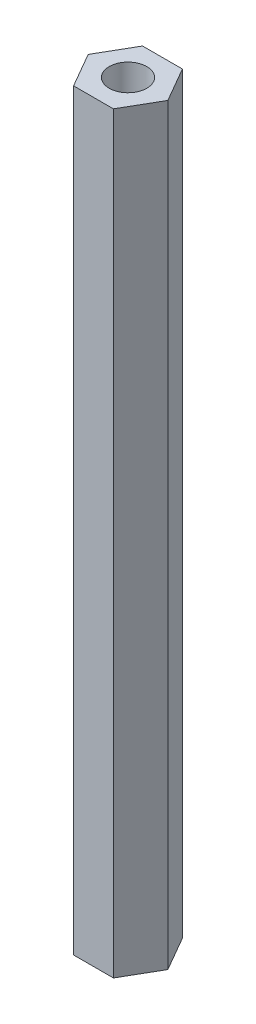
ISO-10303-21;
HEADER;
FILE_DESCRIPTION(('STEP AP214'),'2;1');
FILE_NAME('part.step','',(''),(''),'','','');
FILE_SCHEMA(('AUTOMOTIVE_DESIGN { 1 0 10303 214 1 1 1 1 }'));
ENDSEC;
DATA;
#1=APPLICATION_CONTEXT('core data for automotive mechanical design processes');
#2=APPLICATION_PROTOCOL_DEFINITION('international standard','automotive_design',2000,#1);
#3=PRODUCT_CONTEXT('',#1,'mechanical');
#4=PRODUCT('Part','Part','',(#3));
#5=PRODUCT_RELATED_PRODUCT_CATEGORY('part','',(#4));
#6=PRODUCT_DEFINITION_FORMATION('','',#4);
#7=PRODUCT_DEFINITION_CONTEXT('part definition',#1,'design');
#8=PRODUCT_DEFINITION('design','',#6,#7);
#9=PRODUCT_DEFINITION_SHAPE('','',#8);
#10=(LENGTH_UNIT() NAMED_UNIT(*) SI_UNIT(.MILLI.,.METRE.));
#11=(NAMED_UNIT(*) PLANE_ANGLE_UNIT() SI_UNIT($,.RADIAN.));
#12=(NAMED_UNIT(*) SI_UNIT($,.STERADIAN.) SOLID_ANGLE_UNIT());
#13=UNCERTAINTY_MEASURE_WITH_UNIT(LENGTH_MEASURE(1.E-05),#10,'distance_accuracy_value','');
#14=(GEOMETRIC_REPRESENTATION_CONTEXT(3) GLOBAL_UNCERTAINTY_ASSIGNED_CONTEXT((#13)) GLOBAL_UNIT_ASSIGNED_CONTEXT((#10,
#11,#12)) REPRESENTATION_CONTEXT('',''));
#15=CARTESIAN_POINT('',(0.,0.,0.));
#16=DIRECTION('',(0.,0.,1.));
#17=DIRECTION('',(1.,0.,0.));
#18=AXIS2_PLACEMENT_3D('',#15,#16,#17);
#19=CARTESIAN_POINT('',(1.5877132402715,60.,2.74999999999997));
#20=DIRECTION('',(-0.866025403784441,0.,-0.499999999999995));
#21=DIRECTION('',(-0.499999999999995,0.,0.866025403784442));
#22=AXIS2_PLACEMENT_3D('',#19,#20,#21);
#23=PLANE('',#22);
#24=DIRECTION('',(0.499999999999995,0.,-0.866025403784441));
#25=VECTOR('',#24,1.);
#26=CARTESIAN_POINT('',(1.5877132402715,0.,2.74999999999997));
#27=LINE('',#26,#25);
#28=CARTESIAN_POINT('',(1.5877132402715,0.,2.74999999999997));
#29=VERTEX_POINT('',#28);
#30=CARTESIAN_POINT('',(3.17542648054293,0.,0.));
#31=VERTEX_POINT('',#30);
#32=EDGE_CURVE('E117',#29,#31,#27,.T.);
#33=ORIENTED_EDGE('',*,*,#32,.T.);
#34=DIRECTION('',(0.,-1.,0.));
#35=VECTOR('',#34,1.);
#36=CARTESIAN_POINT('',(3.17542648054293,60.,0.));
#37=LINE('',#36,#35);
#38=CARTESIAN_POINT('',(3.17542648054293,60.,0.));
#39=VERTEX_POINT('',#38);
#40=EDGE_CURVE('E11',#39,#31,#37,.T.);
#41=ORIENTED_EDGE('',*,*,#40,.F.);
#42=DIRECTION('',(0.499999999999995,0.,-0.866025403784441));
#43=VECTOR('',#42,1.);
#44=CARTESIAN_POINT('',(1.5877132402715,60.,2.74999999999997));
#45=LINE('',#44,#43);
#46=CARTESIAN_POINT('',(1.5877132402715,60.,2.74999999999997));
#47=VERTEX_POINT('',#46);
#48=EDGE_CURVE('E128',#47,#39,#45,.T.);
#49=ORIENTED_EDGE('',*,*,#48,.F.);
#50=DIRECTION('',(0.,-1.,0.));
#51=VECTOR('',#50,1.);
#52=CARTESIAN_POINT('',(1.5877132402715,60.,2.74999999999997));
#53=LINE('',#52,#51);
#54=EDGE_CURVE('E113',#47,#29,#53,.T.);
#55=ORIENTED_EDGE('',*,*,#54,.T.);
#56=EDGE_LOOP('',(#33,#41,#49,#55));
#57=FACE_BOUND('',#56,.T.);
#58=ADVANCED_FACE('F33',(#57),#23,.F.);
#59=CARTESIAN_POINT('',(3.17542648054293,60.,0.));
#60=DIRECTION('',(-0.866025403784438,0.,0.500000000000001));
#61=DIRECTION('',(0.500000000000001,0.,0.866025403784438));
#62=AXIS2_PLACEMENT_3D('',#59,#60,#61);
#63=PLANE('',#62);
#64=DIRECTION('',(-0.500000000000001,0.,-0.866025403784438));
#65=VECTOR('',#64,1.);
#66=CARTESIAN_POINT('',(3.17542648054293,0.,0.));
#67=LINE('',#66,#65);
#68=CARTESIAN_POINT('',(1.58771324027146,0.,-2.74999999999999));
#69=VERTEX_POINT('',#68);
#70=EDGE_CURVE('E120',#31,#69,#67,.T.);
#71=ORIENTED_EDGE('',*,*,#70,.T.);
#72=DIRECTION('',(0.,-1.,0.));
#73=VECTOR('',#72,1.);
#74=CARTESIAN_POINT('',(1.58771324027146,60.,-2.74999999999999));
#75=LINE('',#74,#73);
#76=CARTESIAN_POINT('',(1.58771324027146,60.,-2.74999999999999));
#77=VERTEX_POINT('',#76);
#78=EDGE_CURVE('E41',#77,#69,#75,.T.);
#79=ORIENTED_EDGE('',*,*,#78,.F.);
#80=DIRECTION('',(-0.500000000000001,0.,-0.866025403784438));
#81=VECTOR('',#80,1.);
#82=CARTESIAN_POINT('',(3.17542648054293,60.,0.));
#83=LINE('',#82,#81);
#84=EDGE_CURVE('E86',#39,#77,#83,.T.);
#85=ORIENTED_EDGE('',*,*,#84,.F.);
#86=ORIENTED_EDGE('',*,*,#40,.T.);
#87=EDGE_LOOP('',(#71,#79,#85,#86));
#88=FACE_BOUND('',#87,.T.);
#89=ADVANCED_FACE('F153',(#88),#63,.F.);
#90=CARTESIAN_POINT('',(1.58771324027146,60.,-2.74999999999999));
#91=DIRECTION('',(0.,0.,1.));
#92=DIRECTION('',(1.,0.,0.));
#93=AXIS2_PLACEMENT_3D('',#90,#91,#92);
#94=PLANE('',#93);
#95=DIRECTION('',(-1.,0.,0.));
#96=VECTOR('',#95,1.);
#97=CARTESIAN_POINT('',(1.58771324027146,0.,-2.74999999999999));
#98=LINE('',#97,#96);
#99=CARTESIAN_POINT('',(-1.58771324027148,0.,-2.74999999999998));
#100=VERTEX_POINT('',#99);
#101=EDGE_CURVE('E123',#69,#100,#98,.T.);
#102=ORIENTED_EDGE('',*,*,#101,.T.);
#103=DIRECTION('',(0.,-1.,0.));
#104=VECTOR('',#103,1.);
#105=CARTESIAN_POINT('',(-1.58771324027148,60.,-2.74999999999998));
#106=LINE('',#105,#104);
#107=CARTESIAN_POINT('',(-1.58771324027148,60.,-2.74999999999998));
#108=VERTEX_POINT('',#107);
#109=EDGE_CURVE('E108',#108,#100,#106,.T.);
#110=ORIENTED_EDGE('',*,*,#109,.F.);
#111=DIRECTION('',(-1.,0.,0.));
#112=VECTOR('',#111,1.);
#113=CARTESIAN_POINT('',(1.58771324027146,60.,-2.74999999999999));
#114=LINE('',#113,#112);
#115=EDGE_CURVE('E99',#77,#108,#114,.T.);
#116=ORIENTED_EDGE('',*,*,#115,.F.);
#117=ORIENTED_EDGE('',*,*,#78,.T.);
#118=EDGE_LOOP('',(#102,#110,#116,#117));
#119=FACE_BOUND('',#118,.T.);
#120=ADVANCED_FACE('F134',(#119),#94,.F.);
#121=CARTESIAN_POINT('',(-1.58771324027148,60.,-2.74999999999998));
#122=DIRECTION('',(0.866025403784442,0.,0.499999999999995));
#123=DIRECTION('',(0.499999999999995,0.,-0.866025403784442));
#124=AXIS2_PLACEMENT_3D('',#121,#122,#123);
#125=PLANE('',#124);
#126=DIRECTION('',(-0.499999999999995,0.,0.866025403784442));
#127=VECTOR('',#126,1.);
#128=CARTESIAN_POINT('',(-1.58771324027148,0.,-2.74999999999998));
#129=LINE('',#128,#127);
#130=CARTESIAN_POINT('',(-3.17542648054293,0.,0.));
#131=VERTEX_POINT('',#130);
#132=EDGE_CURVE('E107',#100,#131,#129,.T.);
#133=ORIENTED_EDGE('',*,*,#132,.T.);
#134=DIRECTION('',(0.,-1.,0.));
#135=VECTOR('',#134,1.);
#136=CARTESIAN_POINT('',(-3.17542648054293,60.,0.));
#137=LINE('',#136,#135);
#138=CARTESIAN_POINT('',(-3.17542648054293,60.,0.));
#139=VERTEX_POINT('',#138);
#140=EDGE_CURVE('E104',#139,#131,#137,.T.);
#141=ORIENTED_EDGE('',*,*,#140,.F.);
#142=DIRECTION('',(-0.499999999999995,0.,0.866025403784442));
#143=VECTOR('',#142,1.);
#144=CARTESIAN_POINT('',(-1.58771324027148,60.,-2.74999999999998));
#145=LINE('',#144,#143);
#146=EDGE_CURVE('E93',#108,#139,#145,.T.);
#147=ORIENTED_EDGE('',*,*,#146,.F.);
#148=ORIENTED_EDGE('',*,*,#109,.T.);
#149=EDGE_LOOP('',(#133,#141,#147,#148));
#150=FACE_BOUND('',#149,.T.);
#151=ADVANCED_FACE('F105',(#150),#125,.F.);
#152=CARTESIAN_POINT('',(-3.17542648054293,60.,0.));
#153=DIRECTION('',(0.866025403784435,0.,-0.500000000000007));
#154=DIRECTION('',(-0.500000000000007,0.,-0.866025403784435));
#155=AXIS2_PLACEMENT_3D('',#152,#153,#154);
#156=PLANE('',#155);
#157=DIRECTION('',(0.500000000000007,0.,0.866025403784435));
#158=VECTOR('',#157,1.);
#159=CARTESIAN_POINT('',(-3.17542648054293,0.,0.));
#160=LINE('',#159,#158);
#161=CARTESIAN_POINT('',(-1.58771324027144,0.,2.75));
#162=VERTEX_POINT('',#161);
#163=EDGE_CURVE('E72',#131,#162,#160,.T.);
#164=ORIENTED_EDGE('',*,*,#163,.T.);
#165=DIRECTION('',(0.,-1.,0.));
#166=VECTOR('',#165,1.);
#167=CARTESIAN_POINT('',(-1.58771324027144,60.,2.75));
#168=LINE('',#167,#166);
#169=CARTESIAN_POINT('',(-1.58771324027144,60.,2.75));
#170=VERTEX_POINT('',#169);
#171=EDGE_CURVE('E109',#170,#162,#168,.T.);
#172=ORIENTED_EDGE('',*,*,#171,.F.);
#173=DIRECTION('',(0.500000000000007,0.,0.866025403784435));
#174=VECTOR('',#173,1.);
#175=CARTESIAN_POINT('',(-3.17542648054293,60.,0.));
#176=LINE('',#175,#174);
#177=EDGE_CURVE('E97',#139,#170,#176,.T.);
#178=ORIENTED_EDGE('',*,*,#177,.F.);
#179=ORIENTED_EDGE('',*,*,#140,.T.);
#180=EDGE_LOOP('',(#164,#172,#178,#179));
#181=FACE_BOUND('',#180,.T.);
#182=ADVANCED_FACE('F111',(#181),#156,.F.);
#183=CARTESIAN_POINT('',(-1.58771324027144,60.,2.75));
#184=DIRECTION('',(0.,0.,-1.));
#185=DIRECTION('',(-1.,0.,0.));
#186=AXIS2_PLACEMENT_3D('',#183,#184,#185);
#187=PLANE('',#186);
#188=DIRECTION('',(1.,0.,0.));
#189=VECTOR('',#188,1.);
#190=CARTESIAN_POINT('',(-1.58771324027144,0.,2.75));
#191=LINE('',#190,#189);
#192=EDGE_CURVE('E78',#162,#29,#191,.T.);
#193=ORIENTED_EDGE('',*,*,#192,.T.);
#194=ORIENTED_EDGE('',*,*,#54,.F.);
#195=DIRECTION('',(1.,0.,0.));
#196=VECTOR('',#195,1.);
#197=CARTESIAN_POINT('',(-1.58771324027144,60.,2.75));
#198=LINE('',#197,#196);
#199=EDGE_CURVE('E49',#170,#47,#198,.T.);
#200=ORIENTED_EDGE('',*,*,#199,.F.);
#201=ORIENTED_EDGE('',*,*,#171,.T.);
#202=EDGE_LOOP('',(#193,#194,#200,#201));
#203=FACE_BOUND('',#202,.T.);
#204=ADVANCED_FACE('F141',(#203),#187,.F.);
#205=CARTESIAN_POINT('',(0.,60.,0.));
#206=DIRECTION('',(0.,1.,0.));
#207=DIRECTION('',(0.,0.,1.));
#208=AXIS2_PLACEMENT_3D('',#205,#206,#207);
#209=PLANE('',#208);
#210=CARTESIAN_POINT('',(0.,60.,0.));
#211=DIRECTION('',(0.,1.,0.));
#212=DIRECTION('',(0.,0.,1.));
#213=AXIS2_PLACEMENT_3D('',#210,#211,#212);
#214=CIRCLE('',#213,1.5);
#215=CARTESIAN_POINT('',(0.,60.,1.5));
#216=VERTEX_POINT('',#215);
#217=EDGE_CURVE('E236',#216,#216,#214,.T.);
#218=ORIENTED_EDGE('',*,*,#217,.F.);
#219=EDGE_LOOP('',(#218));
#220=FACE_BOUND('',#219,.T.);
#221=ORIENTED_EDGE('',*,*,#48,.T.);
#222=ORIENTED_EDGE('',*,*,#84,.T.);
#223=ORIENTED_EDGE('',*,*,#115,.T.);
#224=ORIENTED_EDGE('',*,*,#146,.T.);
#225=ORIENTED_EDGE('',*,*,#177,.T.);
#226=ORIENTED_EDGE('',*,*,#199,.T.);
#227=EDGE_LOOP('',(#221,#222,#223,#224,#225,#226));
#228=FACE_BOUND('',#227,.T.);
#229=ADVANCED_FACE('F95',(#220,#228),#209,.T.);
#230=CARTESIAN_POINT('',(0.,0.,0.));
#231=DIRECTION('',(0.,1.,0.));
#232=DIRECTION('',(0.,0.,1.));
#233=AXIS2_PLACEMENT_3D('',#230,#231,#232);
#234=PLANE('',#233);
#235=CARTESIAN_POINT('',(0.,0.,0.));
#236=DIRECTION('',(0.,1.,0.));
#237=DIRECTION('',(0.,0.,1.));
#238=AXIS2_PLACEMENT_3D('',#235,#236,#237);
#239=CIRCLE('',#238,1.5);
#240=CARTESIAN_POINT('',(0.,0.,1.5));
#241=VERTEX_POINT('',#240);
#242=EDGE_CURVE('E237',#241,#241,#239,.T.);
#243=ORIENTED_EDGE('',*,*,#242,.T.);
#244=EDGE_LOOP('',(#243));
#245=FACE_BOUND('',#244,.T.);
#246=ORIENTED_EDGE('',*,*,#32,.F.);
#247=ORIENTED_EDGE('',*,*,#192,.F.);
#248=ORIENTED_EDGE('',*,*,#163,.F.);
#249=ORIENTED_EDGE('',*,*,#132,.F.);
#250=ORIENTED_EDGE('',*,*,#101,.F.);
#251=ORIENTED_EDGE('',*,*,#70,.F.);
#252=EDGE_LOOP('',(#246,#247,#248,#249,#250,#251));
#253=FACE_BOUND('',#252,.T.);
#254=ADVANCED_FACE('F137',(#245,#253),#234,.F.);
#255=CARTESIAN_POINT('',(0.,50.,0.));
#256=DIRECTION('',(0.,1.,0.));
#257=DIRECTION('',(0.,0.,1.));
#258=AXIS2_PLACEMENT_3D('',#255,#256,#257);
#259=CYLINDRICAL_SURFACE('',#258,1.5);
#260=CARTESIAN_POINT('',(0.,50.,0.));
#261=DIRECTION('',(0.,1.,0.));
#262=DIRECTION('',(0.,0.,1.));
#263=AXIS2_PLACEMENT_3D('',#260,#261,#262);
#264=CIRCLE('',#263,1.5);
#265=CARTESIAN_POINT('',(0.,50.,1.5));
#266=VERTEX_POINT('',#265);
#267=EDGE_CURVE('E121',#266,#266,#264,.T.);
#268=ORIENTED_EDGE('',*,*,#267,.F.);
#269=EDGE_LOOP('',(#268));
#270=FACE_BOUND('',#269,.T.);
#271=ORIENTED_EDGE('',*,*,#217,.T.);
#272=EDGE_LOOP('',(#271));
#273=FACE_BOUND('',#272,.T.);
#274=ADVANCED_FACE('F188',(#270,#273),#259,.F.);
#275=CARTESIAN_POINT('',(0.,50.,0.));
#276=DIRECTION('',(0.,1.,0.));
#277=DIRECTION('',(0.,0.,1.));
#278=AXIS2_PLACEMENT_3D('',#275,#276,#277);
#279=PLANE('',#278);
#280=ORIENTED_EDGE('',*,*,#267,.T.);
#281=EDGE_LOOP('',(#280));
#282=FACE_BOUND('',#281,.T.);
#283=ADVANCED_FACE('F193',(#282),#279,.T.);
#284=CARTESIAN_POINT('',(0.,10.,0.));
#285=DIRECTION('',(0.,-1.,0.));
#286=DIRECTION('',(0.,0.,-1.));
#287=AXIS2_PLACEMENT_3D('',#284,#285,#286);
#288=CYLINDRICAL_SURFACE('',#287,1.5);
#289=CARTESIAN_POINT('',(0.,10.,0.));
#290=DIRECTION('',(0.,1.,0.));
#291=DIRECTION('',(0.,0.,1.));
#292=AXIS2_PLACEMENT_3D('',#289,#290,#291);
#293=CIRCLE('',#292,1.5);
#294=CARTESIAN_POINT('',(0.,10.,1.5));
#295=VERTEX_POINT('',#294);
#296=EDGE_CURVE('E235',#295,#295,#293,.T.);
#297=ORIENTED_EDGE('',*,*,#296,.T.);
#298=EDGE_LOOP('',(#297));
#299=FACE_BOUND('',#298,.T.);
#300=ORIENTED_EDGE('',*,*,#242,.F.);
#301=EDGE_LOOP('',(#300));
#302=FACE_BOUND('',#301,.T.);
#303=ADVANCED_FACE('F203',(#299,#302),#288,.F.);
#304=CARTESIAN_POINT('',(0.,10.,0.));
#305=DIRECTION('',(0.,-1.,0.));
#306=DIRECTION('',(0.,0.,1.));
#307=AXIS2_PLACEMENT_3D('',#304,#305,#306);
#308=PLANE('',#307);
#309=ORIENTED_EDGE('',*,*,#296,.F.);
#310=EDGE_LOOP('',(#309));
#311=FACE_BOUND('',#310,.T.);
#312=ADVANCED_FACE('F219',(#311),#308,.T.);
#313=CLOSED_SHELL('',(#58,#89,#120,#151,#182,#204,#229,#254,#274,#283,#303,#312));
#314=MANIFOLD_SOLID_BREP('B2',#313);
#315=ADVANCED_BREP_SHAPE_REPRESENTATION('',(#18,#314),#14);
#316=SHAPE_DEFINITION_REPRESENTATION(#9,#315);
ENDSEC;
END-ISO-10303-21;
